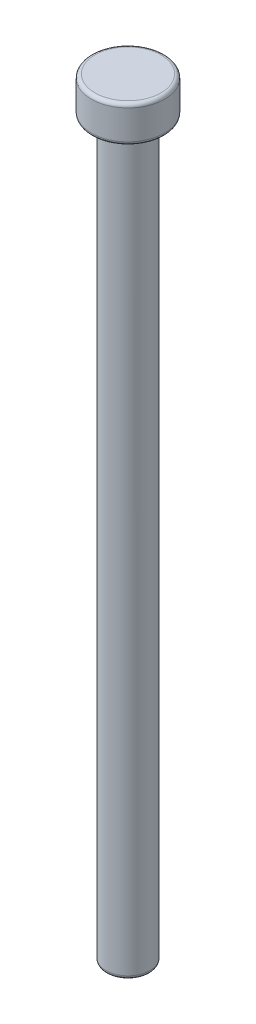
ISO-10303-21;
HEADER;
FILE_DESCRIPTION(('STEP AP214'),'2;1');
FILE_NAME('part.step','',(''),(''),'','','');
FILE_SCHEMA(('AUTOMOTIVE_DESIGN { 1 0 10303 214 1 1 1 1 }'));
ENDSEC;
DATA;
#1=APPLICATION_CONTEXT('core data for automotive mechanical design processes');
#2=APPLICATION_PROTOCOL_DEFINITION('international standard','automotive_design',2000,#1);
#3=PRODUCT_CONTEXT('',#1,'mechanical');
#4=PRODUCT('Part','Part','',(#3));
#5=PRODUCT_RELATED_PRODUCT_CATEGORY('part','',(#4));
#6=PRODUCT_DEFINITION_FORMATION('','',#4);
#7=PRODUCT_DEFINITION_CONTEXT('part definition',#1,'design');
#8=PRODUCT_DEFINITION('design','',#6,#7);
#9=PRODUCT_DEFINITION_SHAPE('','',#8);
#10=(LENGTH_UNIT() NAMED_UNIT(*) SI_UNIT(.MILLI.,.METRE.));
#11=(NAMED_UNIT(*) PLANE_ANGLE_UNIT() SI_UNIT($,.RADIAN.));
#12=(NAMED_UNIT(*) SI_UNIT($,.STERADIAN.) SOLID_ANGLE_UNIT());
#13=UNCERTAINTY_MEASURE_WITH_UNIT(LENGTH_MEASURE(1.E-05),#10,'distance_accuracy_value','');
#14=(GEOMETRIC_REPRESENTATION_CONTEXT(3) GLOBAL_UNCERTAINTY_ASSIGNED_CONTEXT((#13)) GLOBAL_UNIT_ASSIGNED_CONTEXT((#10,
#11,#12)) REPRESENTATION_CONTEXT('',''));
#15=CARTESIAN_POINT('',(0.,0.,0.));
#16=DIRECTION('',(0.,0.,1.));
#17=DIRECTION('',(1.,0.,0.));
#18=AXIS2_PLACEMENT_3D('',#15,#16,#17);
#19=CARTESIAN_POINT('',(0.,0.,0.));
#20=DIRECTION('',(0.,1.,0.));
#21=DIRECTION('',(0.,0.,1.));
#22=AXIS2_PLACEMENT_3D('',#19,#20,#21);
#23=PLANE('',#22);
#24=CARTESIAN_POINT('',(0.,0.,0.));
#25=DIRECTION('',(0.,1.,0.));
#26=DIRECTION('',(0.,0.,1.));
#27=AXIS2_PLACEMENT_3D('',#24,#25,#26);
#28=CIRCLE('',#27,3.5);
#29=CARTESIAN_POINT('',(0.,0.,3.5));
#30=VERTEX_POINT('',#29);
#31=EDGE_CURVE('E44',#30,#30,#28,.T.);
#32=ORIENTED_EDGE('',*,*,#31,.T.);
#33=EDGE_LOOP('',(#32));
#34=FACE_BOUND('',#33,.T.);
#35=CARTESIAN_POINT('',(0.,0.,0.));
#36=DIRECTION('',(0.,1.,0.));
#37=DIRECTION('',(0.,0.,1.));
#38=AXIS2_PLACEMENT_3D('',#35,#36,#37);
#39=CIRCLE('',#38,4.5);
#40=CARTESIAN_POINT('',(0.,0.,4.5));
#41=VERTEX_POINT('',#40);
#42=EDGE_CURVE('E49',#41,#41,#39,.F.);
#43=ORIENTED_EDGE('',*,*,#42,.T.);
#44=EDGE_LOOP('',(#43));
#45=FACE_BOUND('',#44,.T.);
#46=ADVANCED_FACE('F29',(#34,#45),#23,.F.);
#47=CARTESIAN_POINT('',(0.,5.,0.));
#48=DIRECTION('',(0.,-1.,0.));
#49=DIRECTION('',(0.,0.,-1.));
#50=AXIS2_PLACEMENT_3D('',#47,#48,#49);
#51=CYLINDRICAL_SURFACE('',#50,5.);
#52=CARTESIAN_POINT('',(0.,0.5,0.));
#53=DIRECTION('',(0.,1.,0.));
#54=DIRECTION('',(0.,0.,1.));
#55=AXIS2_PLACEMENT_3D('',#52,#53,#54);
#56=CIRCLE('',#55,5.);
#57=CARTESIAN_POINT('',(0.,0.5,5.));
#58=VERTEX_POINT('',#57);
#59=EDGE_CURVE('E36',#58,#58,#56,.T.);
#60=ORIENTED_EDGE('',*,*,#59,.T.);
#61=EDGE_LOOP('',(#60));
#62=FACE_BOUND('',#61,.T.);
#63=CARTESIAN_POINT('',(0.,4.5,0.));
#64=DIRECTION('',(0.,1.,0.));
#65=DIRECTION('',(0.,0.,1.));
#66=AXIS2_PLACEMENT_3D('',#63,#64,#65);
#67=CIRCLE('',#66,5.);
#68=CARTESIAN_POINT('',(0.,4.5,5.));
#69=VERTEX_POINT('',#68);
#70=EDGE_CURVE('E40',#69,#69,#67,.F.);
#71=ORIENTED_EDGE('',*,*,#70,.T.);
#72=EDGE_LOOP('',(#71));
#73=FACE_BOUND('',#72,.T.);
#74=ADVANCED_FACE('F81',(#62,#73),#51,.T.);
#75=CARTESIAN_POINT('',(0.,5.,0.));
#76=DIRECTION('',(0.,1.,0.));
#77=DIRECTION('',(0.,0.,1.));
#78=AXIS2_PLACEMENT_3D('',#75,#76,#77);
#79=PLANE('',#78);
#80=CARTESIAN_POINT('',(0.,5.,0.));
#81=DIRECTION('',(0.,1.,0.));
#82=DIRECTION('',(0.,0.,1.));
#83=AXIS2_PLACEMENT_3D('',#80,#81,#82);
#84=CIRCLE('',#83,4.5);
#85=CARTESIAN_POINT('',(0.,5.,4.5));
#86=VERTEX_POINT('',#85);
#87=EDGE_CURVE('E10',#86,#86,#84,.T.);
#88=ORIENTED_EDGE('',*,*,#87,.T.);
#89=EDGE_LOOP('',(#88));
#90=FACE_BOUND('',#89,.T.);
#91=ADVANCED_FACE('F87',(#90),#79,.T.);
#92=CARTESIAN_POINT('',(0.,-100.,0.));
#93=DIRECTION('',(0.,1.,0.));
#94=DIRECTION('',(0.,0.,1.));
#95=AXIS2_PLACEMENT_3D('',#92,#93,#94);
#96=CYLINDRICAL_SURFACE('',#95,3.);
#97=CARTESIAN_POINT('',(0.,-99.5,0.));
#98=DIRECTION('',(0.,-1.,0.));
#99=DIRECTION('',(0.,0.,-1.));
#100=AXIS2_PLACEMENT_3D('',#97,#98,#99);
#101=CIRCLE('',#100,3.);
#102=CARTESIAN_POINT('',(0.,-99.5,-3.));
#103=VERTEX_POINT('',#102);
#104=EDGE_CURVE('E52',#103,#103,#101,.F.);
#105=ORIENTED_EDGE('',*,*,#104,.T.);
#106=EDGE_LOOP('',(#105));
#107=FACE_BOUND('',#106,.T.);
#108=CARTESIAN_POINT('',(0.,-0.5,0.));
#109=DIRECTION('',(0.,1.,0.));
#110=DIRECTION('',(0.,0.,1.));
#111=AXIS2_PLACEMENT_3D('',#108,#109,#110);
#112=CIRCLE('',#111,3.);
#113=CARTESIAN_POINT('',(0.,-0.5,3.));
#114=VERTEX_POINT('',#113);
#115=EDGE_CURVE('E55',#114,#114,#112,.F.);
#116=ORIENTED_EDGE('',*,*,#115,.T.);
#117=EDGE_LOOP('',(#116));
#118=FACE_BOUND('',#117,.T.);
#119=ADVANCED_FACE('F76',(#107,#118),#96,.T.);
#120=CARTESIAN_POINT('',(0.,-100.,0.));
#121=DIRECTION('',(0.,-1.,0.));
#122=DIRECTION('',(0.,0.,-1.));
#123=AXIS2_PLACEMENT_3D('',#120,#121,#122);
#124=PLANE('',#123);
#125=CARTESIAN_POINT('',(0.,-100.,0.));
#126=DIRECTION('',(0.,-1.,0.));
#127=DIRECTION('',(0.,0.,-1.));
#128=AXIS2_PLACEMENT_3D('',#125,#126,#127);
#129=CIRCLE('',#128,2.5);
#130=CARTESIAN_POINT('',(0.,-100.,-2.5));
#131=VERTEX_POINT('',#130);
#132=EDGE_CURVE('E58',#131,#131,#129,.T.);
#133=ORIENTED_EDGE('',*,*,#132,.T.);
#134=EDGE_LOOP('',(#133));
#135=FACE_BOUND('',#134,.T.);
#136=ADVANCED_FACE('F62',(#135),#124,.T.);
#137=CARTESIAN_POINT('',(0.,-99.5,0.));
#138=DIRECTION('',(0.,-1.,0.));
#139=DIRECTION('',(0.,0.,-1.));
#140=AXIS2_PLACEMENT_3D('',#137,#138,#139);
#141=TOROIDAL_SURFACE('',#140,2.5,0.5);
#142=ORIENTED_EDGE('',*,*,#104,.F.);
#143=EDGE_LOOP('',(#142));
#144=FACE_BOUND('',#143,.T.);
#145=ORIENTED_EDGE('',*,*,#132,.F.);
#146=EDGE_LOOP('',(#145));
#147=FACE_BOUND('',#146,.T.);
#148=ADVANCED_FACE('F64',(#144,#147),#141,.T.);
#149=CARTESIAN_POINT('',(0.,-0.5,0.));
#150=DIRECTION('',(0.,1.,0.));
#151=DIRECTION('',(0.,0.,1.));
#152=AXIS2_PLACEMENT_3D('',#149,#150,#151);
#153=TOROIDAL_SURFACE('',#152,3.5,0.5);
#154=ORIENTED_EDGE('',*,*,#31,.F.);
#155=EDGE_LOOP('',(#154));
#156=FACE_BOUND('',#155,.T.);
#157=ORIENTED_EDGE('',*,*,#115,.F.);
#158=EDGE_LOOP('',(#157));
#159=FACE_BOUND('',#158,.T.);
#160=ADVANCED_FACE('F66',(#156,#159),#153,.F.);
#161=CARTESIAN_POINT('',(0.,0.5,0.));
#162=DIRECTION('',(0.,1.,0.));
#163=DIRECTION('',(0.,0.,1.));
#164=AXIS2_PLACEMENT_3D('',#161,#162,#163);
#165=TOROIDAL_SURFACE('',#164,4.5,0.5);
#166=ORIENTED_EDGE('',*,*,#42,.F.);
#167=EDGE_LOOP('',(#166));
#168=FACE_BOUND('',#167,.T.);
#169=ORIENTED_EDGE('',*,*,#59,.F.);
#170=EDGE_LOOP('',(#169));
#171=FACE_BOUND('',#170,.T.);
#172=ADVANCED_FACE('F73',(#168,#171),#165,.T.);
#173=CARTESIAN_POINT('',(0.,4.5,0.));
#174=DIRECTION('',(0.,1.,0.));
#175=DIRECTION('',(0.,0.,1.));
#176=AXIS2_PLACEMENT_3D('',#173,#174,#175);
#177=TOROIDAL_SURFACE('',#176,4.5,0.5);
#178=ORIENTED_EDGE('',*,*,#70,.F.);
#179=EDGE_LOOP('',(#178));
#180=FACE_BOUND('',#179,.T.);
#181=ORIENTED_EDGE('',*,*,#87,.F.);
#182=EDGE_LOOP('',(#181));
#183=FACE_BOUND('',#182,.T.);
#184=ADVANCED_FACE('F31',(#180,#183),#177,.T.);
#185=CLOSED_SHELL('',(#46,#74,#91,#119,#136,#148,#160,#172,#184));
#186=MANIFOLD_SOLID_BREP('B2',#185);
#187=ADVANCED_BREP_SHAPE_REPRESENTATION('',(#18,#186),#14);
#188=SHAPE_DEFINITION_REPRESENTATION(#9,#187);
ENDSEC;
END-ISO-10303-21;
